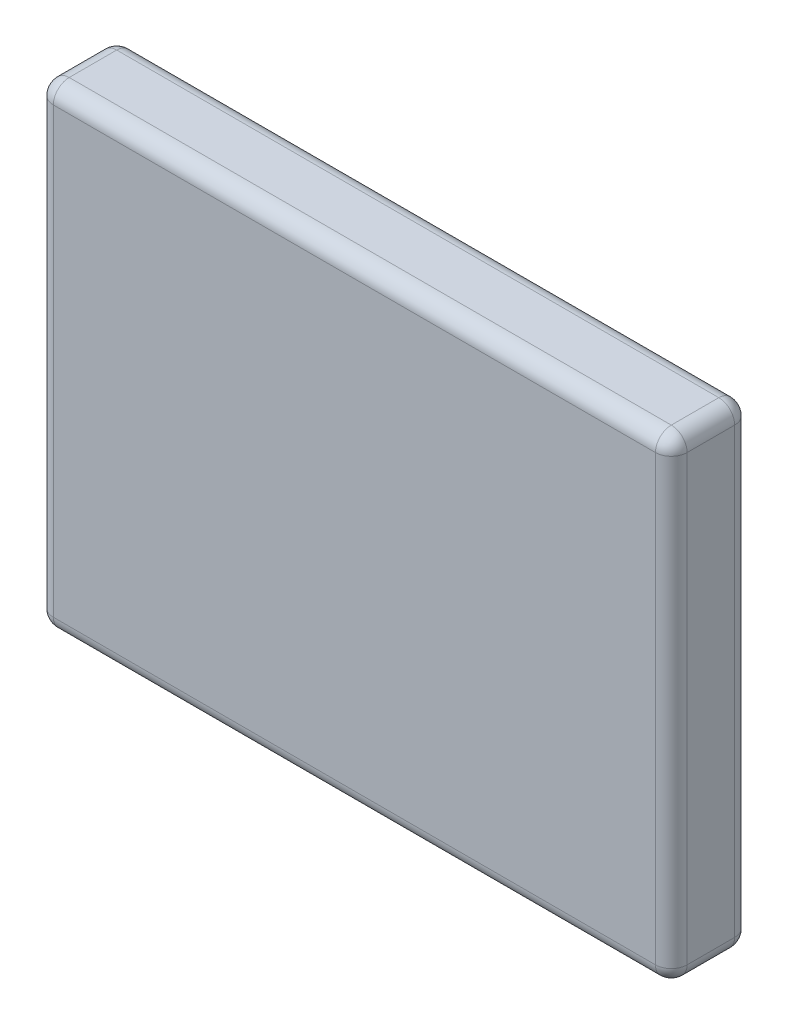
ISO-10303-21;
HEADER;
FILE_DESCRIPTION(('STEP AP214'),'2;1');
FILE_NAME('part.step','',(''),(''),'','','');
FILE_SCHEMA(('AUTOMOTIVE_DESIGN { 1 0 10303 214 1 1 1 1 }'));
ENDSEC;
DATA;
#1=APPLICATION_CONTEXT('core data for automotive mechanical design processes');
#2=APPLICATION_PROTOCOL_DEFINITION('international standard','automotive_design',2000,#1);
#3=PRODUCT_CONTEXT('',#1,'mechanical');
#4=PRODUCT('Part','Part','',(#3));
#5=PRODUCT_RELATED_PRODUCT_CATEGORY('part','',(#4));
#6=PRODUCT_DEFINITION_FORMATION('','',#4);
#7=PRODUCT_DEFINITION_CONTEXT('part definition',#1,'design');
#8=PRODUCT_DEFINITION('design','',#6,#7);
#9=PRODUCT_DEFINITION_SHAPE('','',#8);
#10=(LENGTH_UNIT() NAMED_UNIT(*) SI_UNIT(.MILLI.,.METRE.));
#11=(NAMED_UNIT(*) PLANE_ANGLE_UNIT() SI_UNIT($,.RADIAN.));
#12=(NAMED_UNIT(*) SI_UNIT($,.STERADIAN.) SOLID_ANGLE_UNIT());
#13=UNCERTAINTY_MEASURE_WITH_UNIT(LENGTH_MEASURE(1.E-05),#10,'distance_accuracy_value','');
#14=(GEOMETRIC_REPRESENTATION_CONTEXT(3) GLOBAL_UNCERTAINTY_ASSIGNED_CONTEXT((#13)) GLOBAL_UNIT_ASSIGNED_CONTEXT((#10,
#11,#12)) REPRESENTATION_CONTEXT('',''));
#15=CARTESIAN_POINT('',(0.,0.,0.));
#16=DIRECTION('',(0.,0.,1.));
#17=DIRECTION('',(1.,0.,0.));
#18=AXIS2_PLACEMENT_3D('',#15,#16,#17);
#19=CARTESIAN_POINT('',(0.,0.,12.7));
#20=DIRECTION('',(1.,0.,0.));
#21=DIRECTION('',(0.,0.,-1.));
#22=AXIS2_PLACEMENT_3D('',#19,#20,#21);
#23=PLANE('',#22);
#24=DIRECTION('',(0.,-1.,0.));
#25=VECTOR('',#24,1.);
#26=CARTESIAN_POINT('',(0.,0.,10.16));
#27=LINE('',#26,#25);
#28=CARTESIAN_POINT('',(0.,2.54,10.16));
#29=VERTEX_POINT('',#28);
#30=CARTESIAN_POINT('',(0.,73.66,10.16));
#31=VERTEX_POINT('',#30);
#32=EDGE_CURVE('E157',#29,#31,#27,.F.);
#33=ORIENTED_EDGE('',*,*,#32,.T.);
#34=DIRECTION('',(0.,0.,-1.));
#35=VECTOR('',#34,1.);
#36=CARTESIAN_POINT('',(0.,73.66,12.7));
#37=LINE('',#36,#35);
#38=CARTESIAN_POINT('',(0.,73.66,2.54));
#39=VERTEX_POINT('',#38);
#40=EDGE_CURVE('E165',#31,#39,#37,.T.);
#41=ORIENTED_EDGE('',*,*,#40,.T.);
#42=DIRECTION('',(0.,-1.,0.));
#43=VECTOR('',#42,1.);
#44=CARTESIAN_POINT('',(0.,0.,2.54));
#45=LINE('',#44,#43);
#46=CARTESIAN_POINT('',(0.,2.54,2.54));
#47=VERTEX_POINT('',#46);
#48=EDGE_CURVE('E137',#39,#47,#45,.T.);
#49=ORIENTED_EDGE('',*,*,#48,.T.);
#50=DIRECTION('',(0.,0.,-1.));
#51=VECTOR('',#50,1.);
#52=CARTESIAN_POINT('',(0.,2.54,12.7));
#53=LINE('',#52,#51);
#54=EDGE_CURVE('E152',#47,#29,#53,.F.);
#55=ORIENTED_EDGE('',*,*,#54,.T.);
#56=EDGE_LOOP('',(#33,#41,#49,#55));
#57=FACE_BOUND('',#56,.T.);
#58=ADVANCED_FACE('F39',(#57),#23,.F.);
#59=CARTESIAN_POINT('',(0.,0.,12.7));
#60=DIRECTION('',(0.,1.,0.));
#61=DIRECTION('',(0.,0.,1.));
#62=AXIS2_PLACEMENT_3D('',#59,#60,#61);
#63=PLANE('',#62);
#64=DIRECTION('',(1.,0.,0.));
#65=VECTOR('',#64,1.);
#66=CARTESIAN_POINT('',(101.6,0.,2.54));
#67=LINE('',#66,#65);
#68=CARTESIAN_POINT('',(2.54,0.,2.54));
#69=VERTEX_POINT('',#68);
#70=CARTESIAN_POINT('',(99.06,0.,2.54));
#71=VERTEX_POINT('',#70);
#72=EDGE_CURVE('E176',#69,#71,#67,.T.);
#73=ORIENTED_EDGE('',*,*,#72,.T.);
#74=DIRECTION('',(0.,0.,-1.));
#75=VECTOR('',#74,1.);
#76=CARTESIAN_POINT('',(99.06,0.,12.7));
#77=LINE('',#76,#75);
#78=CARTESIAN_POINT('',(99.06,0.,10.16));
#79=VERTEX_POINT('',#78);
#80=EDGE_CURVE('E185',#71,#79,#77,.F.);
#81=ORIENTED_EDGE('',*,*,#80,.T.);
#82=DIRECTION('',(1.,0.,0.));
#83=VECTOR('',#82,1.);
#84=CARTESIAN_POINT('',(0.,0.,10.16));
#85=LINE('',#84,#83);
#86=CARTESIAN_POINT('',(2.54,0.,10.16));
#87=VERTEX_POINT('',#86);
#88=EDGE_CURVE('E179',#79,#87,#85,.F.);
#89=ORIENTED_EDGE('',*,*,#88,.T.);
#90=DIRECTION('',(0.,0.,-1.));
#91=VECTOR('',#90,1.);
#92=CARTESIAN_POINT('',(2.54,0.,12.7));
#93=LINE('',#92,#91);
#94=EDGE_CURVE('E173',#87,#69,#93,.T.);
#95=ORIENTED_EDGE('',*,*,#94,.T.);
#96=EDGE_LOOP('',(#73,#81,#89,#95));
#97=FACE_BOUND('',#96,.T.);
#98=ADVANCED_FACE('F328',(#97),#63,.F.);
#99=CARTESIAN_POINT('',(101.6,0.,12.7));
#100=DIRECTION('',(-1.,0.,0.));
#101=DIRECTION('',(0.,0.,1.));
#102=AXIS2_PLACEMENT_3D('',#99,#100,#101);
#103=PLANE('',#102);
#104=DIRECTION('',(0.,1.,0.));
#105=VECTOR('',#104,1.);
#106=CARTESIAN_POINT('',(101.6,76.2,2.54));
#107=LINE('',#106,#105);
#108=CARTESIAN_POINT('',(101.6,2.54,2.54));
#109=VERTEX_POINT('',#108);
#110=CARTESIAN_POINT('',(101.6,73.66,2.54));
#111=VERTEX_POINT('',#110);
#112=EDGE_CURVE('E189',#109,#111,#107,.T.);
#113=ORIENTED_EDGE('',*,*,#112,.T.);
#114=DIRECTION('',(0.,0.,-1.));
#115=VECTOR('',#114,1.);
#116=CARTESIAN_POINT('',(101.6,73.66,12.7));
#117=LINE('',#116,#115);
#118=CARTESIAN_POINT('',(101.6,73.66,10.16));
#119=VERTEX_POINT('',#118);
#120=EDGE_CURVE('E192',#111,#119,#117,.F.);
#121=ORIENTED_EDGE('',*,*,#120,.T.);
#122=DIRECTION('',(0.,1.,0.));
#123=VECTOR('',#122,1.);
#124=CARTESIAN_POINT('',(101.6,0.,10.16));
#125=LINE('',#124,#123);
#126=CARTESIAN_POINT('',(101.6,2.54,10.16));
#127=VERTEX_POINT('',#126);
#128=EDGE_CURVE('E187',#119,#127,#125,.F.);
#129=ORIENTED_EDGE('',*,*,#128,.T.);
#130=DIRECTION('',(0.,0.,-1.));
#131=VECTOR('',#130,1.);
#132=CARTESIAN_POINT('',(101.6,2.54,12.7));
#133=LINE('',#132,#131);
#134=EDGE_CURVE('E184',#127,#109,#133,.T.);
#135=ORIENTED_EDGE('',*,*,#134,.T.);
#136=EDGE_LOOP('',(#113,#121,#129,#135));
#137=FACE_BOUND('',#136,.T.);
#138=ADVANCED_FACE('F296',(#137),#103,.F.);
#139=CARTESIAN_POINT('',(0.,76.2,12.7));
#140=DIRECTION('',(0.,-1.,0.));
#141=DIRECTION('',(0.,0.,-1.));
#142=AXIS2_PLACEMENT_3D('',#139,#140,#141);
#143=PLANE('',#142);
#144=DIRECTION('',(-1.,0.,0.));
#145=VECTOR('',#144,1.);
#146=CARTESIAN_POINT('',(0.,76.2,2.54));
#147=LINE('',#146,#145);
#148=CARTESIAN_POINT('',(99.06,76.2,2.54));
#149=VERTEX_POINT('',#148);
#150=CARTESIAN_POINT('',(2.54,76.2,2.54));
#151=VERTEX_POINT('',#150);
#152=EDGE_CURVE('E197',#149,#151,#147,.T.);
#153=ORIENTED_EDGE('',*,*,#152,.T.);
#154=DIRECTION('',(0.,0.,-1.));
#155=VECTOR('',#154,1.);
#156=CARTESIAN_POINT('',(2.54,76.2,12.7));
#157=LINE('',#156,#155);
#158=CARTESIAN_POINT('',(2.54,76.2,10.16));
#159=VERTEX_POINT('',#158);
#160=EDGE_CURVE('E199',#151,#159,#157,.F.);
#161=ORIENTED_EDGE('',*,*,#160,.T.);
#162=DIRECTION('',(-1.,0.,0.));
#163=VECTOR('',#162,1.);
#164=CARTESIAN_POINT('',(0.,76.2,10.16));
#165=LINE('',#164,#163);
#166=CARTESIAN_POINT('',(99.06,76.2,10.16));
#167=VERTEX_POINT('',#166);
#168=EDGE_CURVE('E193',#159,#167,#165,.F.);
#169=ORIENTED_EDGE('',*,*,#168,.T.);
#170=DIRECTION('',(0.,0.,-1.));
#171=VECTOR('',#170,1.);
#172=CARTESIAN_POINT('',(99.06,76.2,12.7));
#173=LINE('',#172,#171);
#174=EDGE_CURVE('E195',#167,#149,#173,.T.);
#175=ORIENTED_EDGE('',*,*,#174,.T.);
#176=EDGE_LOOP('',(#153,#161,#169,#175));
#177=FACE_BOUND('',#176,.T.);
#178=ADVANCED_FACE('F274',(#177),#143,.F.);
#179=CARTESIAN_POINT('',(0.,0.,12.7));
#180=DIRECTION('',(0.,0.,-1.));
#181=DIRECTION('',(-1.,0.,0.));
#182=AXIS2_PLACEMENT_3D('',#179,#180,#181);
#183=PLANE('',#182);
#184=DIRECTION('',(-1.,0.,0.));
#185=VECTOR('',#184,1.);
#186=CARTESIAN_POINT('',(0.,73.66,12.7));
#187=LINE('',#186,#185);
#188=CARTESIAN_POINT('',(99.06,73.66,12.7));
#189=VERTEX_POINT('',#188);
#190=CARTESIAN_POINT('',(2.54,73.66,12.7));
#191=VERTEX_POINT('',#190);
#192=EDGE_CURVE('E205',#189,#191,#187,.T.);
#193=ORIENTED_EDGE('',*,*,#192,.T.);
#194=DIRECTION('',(0.,-1.,0.));
#195=VECTOR('',#194,1.);
#196=CARTESIAN_POINT('',(2.54,0.,12.7));
#197=LINE('',#196,#195);
#198=CARTESIAN_POINT('',(2.54,2.54,12.7));
#199=VERTEX_POINT('',#198);
#200=EDGE_CURVE('E11',#191,#199,#197,.T.);
#201=ORIENTED_EDGE('',*,*,#200,.T.);
#202=DIRECTION('',(1.,0.,0.));
#203=VECTOR('',#202,1.);
#204=CARTESIAN_POINT('',(0.,2.54,12.7));
#205=LINE('',#204,#203);
#206=CARTESIAN_POINT('',(99.06,2.54,12.7));
#207=VERTEX_POINT('',#206);
#208=EDGE_CURVE('E48',#199,#207,#205,.T.);
#209=ORIENTED_EDGE('',*,*,#208,.T.);
#210=DIRECTION('',(0.,1.,0.));
#211=VECTOR('',#210,1.);
#212=CARTESIAN_POINT('',(99.06,0.,12.7));
#213=LINE('',#212,#211);
#214=EDGE_CURVE('E204',#207,#189,#213,.T.);
#215=ORIENTED_EDGE('',*,*,#214,.T.);
#216=EDGE_LOOP('',(#193,#201,#209,#215));
#217=FACE_BOUND('',#216,.T.);
#218=ADVANCED_FACE('F284',(#217),#183,.F.);
#219=CARTESIAN_POINT('',(0.,0.,0.));
#220=DIRECTION('',(0.,0.,-1.));
#221=DIRECTION('',(-1.,0.,0.));
#222=AXIS2_PLACEMENT_3D('',#219,#220,#221);
#223=PLANE('',#222);
#224=DIRECTION('',(1.,0.,0.));
#225=VECTOR('',#224,1.);
#226=CARTESIAN_POINT('',(0.,2.54,0.));
#227=LINE('',#226,#225);
#228=CARTESIAN_POINT('',(99.06,2.54,0.));
#229=VERTEX_POINT('',#228);
#230=CARTESIAN_POINT('',(2.54,2.54,0.));
#231=VERTEX_POINT('',#230);
#232=EDGE_CURVE('E175',#229,#231,#227,.F.);
#233=ORIENTED_EDGE('',*,*,#232,.T.);
#234=DIRECTION('',(0.,-1.,0.));
#235=VECTOR('',#234,1.);
#236=CARTESIAN_POINT('',(2.54,76.2,0.));
#237=LINE('',#236,#235);
#238=CARTESIAN_POINT('',(2.54,73.66,0.));
#239=VERTEX_POINT('',#238);
#240=EDGE_CURVE('E140',#231,#239,#237,.F.);
#241=ORIENTED_EDGE('',*,*,#240,.T.);
#242=DIRECTION('',(-1.,0.,0.));
#243=VECTOR('',#242,1.);
#244=CARTESIAN_POINT('',(101.6,73.66,0.));
#245=LINE('',#244,#243);
#246=CARTESIAN_POINT('',(99.06,73.66,0.));
#247=VERTEX_POINT('',#246);
#248=EDGE_CURVE('E164',#239,#247,#245,.F.);
#249=ORIENTED_EDGE('',*,*,#248,.T.);
#250=DIRECTION('',(0.,1.,0.));
#251=VECTOR('',#250,1.);
#252=CARTESIAN_POINT('',(99.06,0.,0.));
#253=LINE('',#252,#251);
#254=EDGE_CURVE('E168',#247,#229,#253,.F.);
#255=ORIENTED_EDGE('',*,*,#254,.T.);
#256=EDGE_LOOP('',(#233,#241,#249,#255));
#257=FACE_BOUND('',#256,.T.);
#258=ADVANCED_FACE('F362',(#257),#223,.T.);
#259=CARTESIAN_POINT('',(99.06,0.,10.16));
#260=DIRECTION('',(0.,1.,0.));
#261=DIRECTION('',(0.,0.,1.));
#262=AXIS2_PLACEMENT_3D('',#259,#260,#261);
#263=CYLINDRICAL_SURFACE('',#262,2.54);
#264=CARTESIAN_POINT('',(99.06,73.66,10.16));
#265=DIRECTION('',(0.,1.,0.));
#266=DIRECTION('',(0.,0.,1.));
#267=AXIS2_PLACEMENT_3D('',#264,#265,#266);
#268=CIRCLE('',#267,2.54);
#269=EDGE_CURVE('E43',#189,#119,#268,.T.);
#270=ORIENTED_EDGE('',*,*,#269,.F.);
#271=ORIENTED_EDGE('',*,*,#214,.F.);
#272=CARTESIAN_POINT('',(99.06,2.54,10.16));
#273=DIRECTION('',(0.,-1.,0.));
#274=DIRECTION('',(0.,0.,-1.));
#275=AXIS2_PLACEMENT_3D('',#272,#273,#274);
#276=CIRCLE('',#275,2.54);
#277=EDGE_CURVE('E251',#127,#207,#276,.T.);
#278=ORIENTED_EDGE('',*,*,#277,.F.);
#279=ORIENTED_EDGE('',*,*,#128,.F.);
#280=EDGE_LOOP('',(#270,#271,#278,#279));
#281=FACE_BOUND('',#280,.T.);
#282=ADVANCED_FACE('F41',(#281),#263,.T.);
#283=CARTESIAN_POINT('',(99.06,73.66,10.16));
#284=DIRECTION('',(1.,0.,0.));
#285=DIRECTION('',(0.,0.,-1.));
#286=AXIS2_PLACEMENT_3D('',#283,#284,#285);
#287=SPHERICAL_SURFACE('',#286,2.54);
#288=CARTESIAN_POINT('',(99.06,73.66,10.16));
#289=DIRECTION('',(1.,0.,0.));
#290=DIRECTION('',(0.,0.,-1.));
#291=AXIS2_PLACEMENT_3D('',#288,#289,#290);
#292=CIRCLE('',#291,2.54);
#293=EDGE_CURVE('E250',#189,#167,#292,.F.);
#294=ORIENTED_EDGE('',*,*,#293,.F.);
#295=ORIENTED_EDGE('',*,*,#269,.T.);
#296=CARTESIAN_POINT('',(99.06,73.66,10.16));
#297=DIRECTION('',(0.,0.,1.));
#298=DIRECTION('',(1.,0.,0.));
#299=AXIS2_PLACEMENT_3D('',#296,#297,#298);
#300=CIRCLE('',#299,2.54);
#301=EDGE_CURVE('E253',#167,#119,#300,.F.);
#302=ORIENTED_EDGE('',*,*,#301,.F.);
#303=EDGE_LOOP('',(#294,#295,#302));
#304=FACE_BOUND('',#303,.T.);
#305=ADVANCED_FACE('F262',(#304),#287,.T.);
#306=CARTESIAN_POINT('',(99.06,2.54,10.16));
#307=DIRECTION('',(0.,0.,1.));
#308=DIRECTION('',(1.,0.,0.));
#309=AXIS2_PLACEMENT_3D('',#306,#307,#308);
#310=SPHERICAL_SURFACE('',#309,2.54);
#311=CARTESIAN_POINT('',(99.06,2.54,10.16));
#312=DIRECTION('',(0.,0.,1.));
#313=DIRECTION('',(1.,0.,0.));
#314=AXIS2_PLACEMENT_3D('',#311,#312,#313);
#315=CIRCLE('',#314,2.54);
#316=EDGE_CURVE('E245',#127,#79,#315,.F.);
#317=ORIENTED_EDGE('',*,*,#316,.F.);
#318=ORIENTED_EDGE('',*,*,#277,.T.);
#319=CARTESIAN_POINT('',(99.06,2.54,10.16));
#320=DIRECTION('',(1.,0.,0.));
#321=DIRECTION('',(0.,0.,-1.));
#322=AXIS2_PLACEMENT_3D('',#319,#320,#321);
#323=CIRCLE('',#322,2.54);
#324=EDGE_CURVE('E243',#79,#207,#323,.F.);
#325=ORIENTED_EDGE('',*,*,#324,.F.);
#326=EDGE_LOOP('',(#317,#318,#325));
#327=FACE_BOUND('',#326,.T.);
#328=ADVANCED_FACE('F292',(#327),#310,.T.);
#329=CARTESIAN_POINT('',(99.06,73.66,12.7));
#330=DIRECTION('',(0.,0.,-1.));
#331=DIRECTION('',(-1.,0.,0.));
#332=AXIS2_PLACEMENT_3D('',#329,#330,#331);
#333=CYLINDRICAL_SURFACE('',#332,2.54);
#334=ORIENTED_EDGE('',*,*,#301,.T.);
#335=ORIENTED_EDGE('',*,*,#120,.F.);
#336=CARTESIAN_POINT('',(99.06,73.66,2.54));
#337=DIRECTION('',(0.,0.,-1.));
#338=DIRECTION('',(-1.,0.,0.));
#339=AXIS2_PLACEMENT_3D('',#336,#337,#338);
#340=CIRCLE('',#339,2.54);
#341=EDGE_CURVE('E240',#149,#111,#340,.T.);
#342=ORIENTED_EDGE('',*,*,#341,.F.);
#343=ORIENTED_EDGE('',*,*,#174,.F.);
#344=EDGE_LOOP('',(#334,#335,#342,#343));
#345=FACE_BOUND('',#344,.T.);
#346=ADVANCED_FACE('F271',(#345),#333,.T.);
#347=CARTESIAN_POINT('',(0.,73.66,10.16));
#348=DIRECTION('',(-1.,0.,0.));
#349=DIRECTION('',(0.,0.,1.));
#350=AXIS2_PLACEMENT_3D('',#347,#348,#349);
#351=CYLINDRICAL_SURFACE('',#350,2.54);
#352=ORIENTED_EDGE('',*,*,#293,.T.);
#353=ORIENTED_EDGE('',*,*,#168,.F.);
#354=CARTESIAN_POINT('',(2.54,73.66,10.16));
#355=DIRECTION('',(-1.,0.,0.));
#356=DIRECTION('',(0.,0.,1.));
#357=AXIS2_PLACEMENT_3D('',#354,#355,#356);
#358=CIRCLE('',#357,2.54);
#359=EDGE_CURVE('E231',#191,#159,#358,.T.);
#360=ORIENTED_EDGE('',*,*,#359,.F.);
#361=ORIENTED_EDGE('',*,*,#192,.F.);
#362=EDGE_LOOP('',(#352,#353,#360,#361));
#363=FACE_BOUND('',#362,.T.);
#364=ADVANCED_FACE('F282',(#363),#351,.T.);
#365=CARTESIAN_POINT('',(2.54,0.,10.16));
#366=DIRECTION('',(0.,-1.,0.));
#367=DIRECTION('',(0.,0.,-1.));
#368=AXIS2_PLACEMENT_3D('',#365,#366,#367);
#369=CYLINDRICAL_SURFACE('',#368,2.54);
#370=CARTESIAN_POINT('',(2.54,2.54,10.16));
#371=DIRECTION('',(0.,-1.,0.));
#372=DIRECTION('',(0.,0.,-1.));
#373=AXIS2_PLACEMENT_3D('',#370,#371,#372);
#374=CIRCLE('',#373,2.54);
#375=EDGE_CURVE('E226',#199,#29,#374,.T.);
#376=ORIENTED_EDGE('',*,*,#375,.F.);
#377=ORIENTED_EDGE('',*,*,#200,.F.);
#378=CARTESIAN_POINT('',(2.54,73.66,10.16));
#379=DIRECTION('',(0.,1.,0.));
#380=DIRECTION('',(0.,0.,1.));
#381=AXIS2_PLACEMENT_3D('',#378,#379,#380);
#382=CIRCLE('',#381,2.54);
#383=EDGE_CURVE('E232',#31,#191,#382,.T.);
#384=ORIENTED_EDGE('',*,*,#383,.F.);
#385=ORIENTED_EDGE('',*,*,#32,.F.);
#386=EDGE_LOOP('',(#376,#377,#384,#385));
#387=FACE_BOUND('',#386,.T.);
#388=ADVANCED_FACE('F287',(#387),#369,.T.);
#389=CARTESIAN_POINT('',(0.,2.54,10.16));
#390=DIRECTION('',(1.,0.,0.));
#391=DIRECTION('',(0.,0.,-1.));
#392=AXIS2_PLACEMENT_3D('',#389,#390,#391);
#393=CYLINDRICAL_SURFACE('',#392,2.54);
#394=ORIENTED_EDGE('',*,*,#324,.T.);
#395=ORIENTED_EDGE('',*,*,#208,.F.);
#396=CARTESIAN_POINT('',(2.54,2.54,10.16));
#397=DIRECTION('',(-1.,0.,0.));
#398=DIRECTION('',(0.,0.,1.));
#399=AXIS2_PLACEMENT_3D('',#396,#397,#398);
#400=CIRCLE('',#399,2.54);
#401=EDGE_CURVE('E57',#87,#199,#400,.T.);
#402=ORIENTED_EDGE('',*,*,#401,.F.);
#403=ORIENTED_EDGE('',*,*,#88,.F.);
#404=EDGE_LOOP('',(#394,#395,#402,#403));
#405=FACE_BOUND('',#404,.T.);
#406=ADVANCED_FACE('F286',(#405),#393,.T.);
#407=CARTESIAN_POINT('',(99.06,2.54,12.7));
#408=DIRECTION('',(0.,0.,-1.));
#409=DIRECTION('',(-1.,0.,0.));
#410=AXIS2_PLACEMENT_3D('',#407,#408,#409);
#411=CYLINDRICAL_SURFACE('',#410,2.54);
#412=ORIENTED_EDGE('',*,*,#316,.T.);
#413=ORIENTED_EDGE('',*,*,#80,.F.);
#414=CARTESIAN_POINT('',(99.06,2.54,2.54));
#415=DIRECTION('',(0.,0.,-1.));
#416=DIRECTION('',(-1.,0.,0.));
#417=AXIS2_PLACEMENT_3D('',#414,#415,#416);
#418=CIRCLE('',#417,2.54);
#419=EDGE_CURVE('E223',#109,#71,#418,.T.);
#420=ORIENTED_EDGE('',*,*,#419,.F.);
#421=ORIENTED_EDGE('',*,*,#134,.F.);
#422=EDGE_LOOP('',(#412,#413,#420,#421));
#423=FACE_BOUND('',#422,.T.);
#424=ADVANCED_FACE('F297',(#423),#411,.T.);
#425=CARTESIAN_POINT('',(99.06,0.,2.54));
#426=DIRECTION('',(0.,-1.,0.));
#427=DIRECTION('',(0.,0.,-1.));
#428=AXIS2_PLACEMENT_3D('',#425,#426,#427);
#429=CYLINDRICAL_SURFACE('',#428,2.54);
#430=CARTESIAN_POINT('',(99.06,73.66,2.54));
#431=DIRECTION('',(0.,1.,0.));
#432=DIRECTION('',(0.,0.,1.));
#433=AXIS2_PLACEMENT_3D('',#430,#431,#432);
#434=CIRCLE('',#433,2.54);
#435=EDGE_CURVE('E239',#111,#247,#434,.T.);
#436=ORIENTED_EDGE('',*,*,#435,.F.);
#437=ORIENTED_EDGE('',*,*,#112,.F.);
#438=CARTESIAN_POINT('',(99.06,2.54,2.54));
#439=DIRECTION('',(0.,-1.,0.));
#440=DIRECTION('',(0.,0.,-1.));
#441=AXIS2_PLACEMENT_3D('',#438,#439,#440);
#442=CIRCLE('',#441,2.54);
#443=EDGE_CURVE('E225',#229,#109,#442,.T.);
#444=ORIENTED_EDGE('',*,*,#443,.F.);
#445=ORIENTED_EDGE('',*,*,#254,.F.);
#446=EDGE_LOOP('',(#436,#437,#444,#445));
#447=FACE_BOUND('',#446,.T.);
#448=ADVANCED_FACE('F305',(#447),#429,.T.);
#449=CARTESIAN_POINT('',(99.06,73.66,2.54));
#450=DIRECTION('',(1.,0.,0.));
#451=DIRECTION('',(0.,0.,-1.));
#452=AXIS2_PLACEMENT_3D('',#449,#450,#451);
#453=SPHERICAL_SURFACE('',#452,2.54);
#454=ORIENTED_EDGE('',*,*,#341,.T.);
#455=ORIENTED_EDGE('',*,*,#435,.T.);
#456=CARTESIAN_POINT('',(99.06,73.66,2.54));
#457=DIRECTION('',(1.,0.,0.));
#458=DIRECTION('',(0.,0.,-1.));
#459=AXIS2_PLACEMENT_3D('',#456,#457,#458);
#460=CIRCLE('',#459,2.54);
#461=EDGE_CURVE('E218',#149,#247,#460,.F.);
#462=ORIENTED_EDGE('',*,*,#461,.F.);
#463=EDGE_LOOP('',(#454,#455,#462));
#464=FACE_BOUND('',#463,.T.);
#465=ADVANCED_FACE('F307',(#464),#453,.T.);
#466=CARTESIAN_POINT('',(2.54,73.66,10.16));
#467=DIRECTION('',(0.,0.,1.));
#468=DIRECTION('',(1.,0.,0.));
#469=AXIS2_PLACEMENT_3D('',#466,#467,#468);
#470=SPHERICAL_SURFACE('',#469,2.54);
#471=ORIENTED_EDGE('',*,*,#383,.T.);
#472=ORIENTED_EDGE('',*,*,#359,.T.);
#473=CARTESIAN_POINT('',(2.54,73.66,10.16));
#474=DIRECTION('',(0.,0.,1.));
#475=DIRECTION('',(1.,0.,0.));
#476=AXIS2_PLACEMENT_3D('',#473,#474,#475);
#477=CIRCLE('',#476,2.54);
#478=EDGE_CURVE('E216',#31,#159,#477,.F.);
#479=ORIENTED_EDGE('',*,*,#478,.F.);
#480=EDGE_LOOP('',(#471,#472,#479));
#481=FACE_BOUND('',#480,.T.);
#482=ADVANCED_FACE('F320',(#481),#470,.T.);
#483=CARTESIAN_POINT('',(2.54,2.54,10.16));
#484=DIRECTION('',(0.,0.,1.));
#485=DIRECTION('',(1.,0.,0.));
#486=AXIS2_PLACEMENT_3D('',#483,#484,#485);
#487=SPHERICAL_SURFACE('',#486,2.54);
#488=ORIENTED_EDGE('',*,*,#401,.T.);
#489=ORIENTED_EDGE('',*,*,#375,.T.);
#490=CARTESIAN_POINT('',(2.54,2.54,10.16));
#491=DIRECTION('',(0.,0.,1.));
#492=DIRECTION('',(1.,0.,0.));
#493=AXIS2_PLACEMENT_3D('',#490,#491,#492);
#494=CIRCLE('',#493,2.54);
#495=EDGE_CURVE('E156',#87,#29,#494,.F.);
#496=ORIENTED_EDGE('',*,*,#495,.F.);
#497=EDGE_LOOP('',(#488,#489,#496));
#498=FACE_BOUND('',#497,.T.);
#499=ADVANCED_FACE('F317',(#498),#487,.T.);
#500=CARTESIAN_POINT('',(99.06,2.54,2.54));
#501=DIRECTION('',(1.,0.,0.));
#502=DIRECTION('',(0.,0.,-1.));
#503=AXIS2_PLACEMENT_3D('',#500,#501,#502);
#504=SPHERICAL_SURFACE('',#503,2.54);
#505=ORIENTED_EDGE('',*,*,#443,.T.);
#506=ORIENTED_EDGE('',*,*,#419,.T.);
#507=CARTESIAN_POINT('',(99.06,2.54,2.54));
#508=DIRECTION('',(1.,0.,0.));
#509=DIRECTION('',(0.,0.,-1.));
#510=AXIS2_PLACEMENT_3D('',#507,#508,#509);
#511=CIRCLE('',#510,2.54);
#512=EDGE_CURVE('E213',#229,#71,#511,.F.);
#513=ORIENTED_EDGE('',*,*,#512,.F.);
#514=EDGE_LOOP('',(#505,#506,#513));
#515=FACE_BOUND('',#514,.T.);
#516=ADVANCED_FACE('F324',(#515),#504,.T.);
#517=CARTESIAN_POINT('',(0.,73.66,2.54));
#518=DIRECTION('',(1.,0.,0.));
#519=DIRECTION('',(0.,0.,-1.));
#520=AXIS2_PLACEMENT_3D('',#517,#518,#519);
#521=CYLINDRICAL_SURFACE('',#520,2.54);
#522=ORIENTED_EDGE('',*,*,#461,.T.);
#523=ORIENTED_EDGE('',*,*,#248,.F.);
#524=CARTESIAN_POINT('',(2.54,73.66,2.54));
#525=DIRECTION('',(-1.,0.,0.));
#526=DIRECTION('',(0.,0.,1.));
#527=AXIS2_PLACEMENT_3D('',#524,#525,#526);
#528=CIRCLE('',#527,2.54);
#529=EDGE_CURVE('E209',#151,#239,#528,.T.);
#530=ORIENTED_EDGE('',*,*,#529,.F.);
#531=ORIENTED_EDGE('',*,*,#152,.F.);
#532=EDGE_LOOP('',(#522,#523,#530,#531));
#533=FACE_BOUND('',#532,.T.);
#534=ADVANCED_FACE('F309',(#533),#521,.T.);
#535=CARTESIAN_POINT('',(2.54,73.66,12.7));
#536=DIRECTION('',(0.,0.,-1.));
#537=DIRECTION('',(-1.,0.,0.));
#538=AXIS2_PLACEMENT_3D('',#535,#536,#537);
#539=CYLINDRICAL_SURFACE('',#538,2.54);
#540=ORIENTED_EDGE('',*,*,#478,.T.);
#541=ORIENTED_EDGE('',*,*,#160,.F.);
#542=CARTESIAN_POINT('',(2.54,73.66,2.54));
#543=DIRECTION('',(0.,0.,-1.));
#544=DIRECTION('',(-1.,0.,0.));
#545=AXIS2_PLACEMENT_3D('',#542,#543,#544);
#546=CIRCLE('',#545,2.54);
#547=EDGE_CURVE('E151',#39,#151,#546,.T.);
#548=ORIENTED_EDGE('',*,*,#547,.F.);
#549=ORIENTED_EDGE('',*,*,#40,.F.);
#550=EDGE_LOOP('',(#540,#541,#548,#549));
#551=FACE_BOUND('',#550,.T.);
#552=ADVANCED_FACE('F312',(#551),#539,.T.);
#553=CARTESIAN_POINT('',(2.54,2.54,12.7));
#554=DIRECTION('',(0.,0.,-1.));
#555=DIRECTION('',(-1.,0.,0.));
#556=AXIS2_PLACEMENT_3D('',#553,#554,#555);
#557=CYLINDRICAL_SURFACE('',#556,2.54);
#558=ORIENTED_EDGE('',*,*,#495,.T.);
#559=ORIENTED_EDGE('',*,*,#54,.F.);
#560=CARTESIAN_POINT('',(2.54,2.54,2.54));
#561=DIRECTION('',(0.,0.,-1.));
#562=DIRECTION('',(-1.,0.,0.));
#563=AXIS2_PLACEMENT_3D('',#560,#561,#562);
#564=CIRCLE('',#563,2.54);
#565=EDGE_CURVE('E145',#69,#47,#564,.T.);
#566=ORIENTED_EDGE('',*,*,#565,.F.);
#567=ORIENTED_EDGE('',*,*,#94,.F.);
#568=EDGE_LOOP('',(#558,#559,#566,#567));
#569=FACE_BOUND('',#568,.T.);
#570=ADVANCED_FACE('F154',(#569),#557,.T.);
#571=CARTESIAN_POINT('',(0.,2.54,2.54));
#572=DIRECTION('',(-1.,0.,0.));
#573=DIRECTION('',(0.,0.,1.));
#574=AXIS2_PLACEMENT_3D('',#571,#572,#573);
#575=CYLINDRICAL_SURFACE('',#574,2.54);
#576=ORIENTED_EDGE('',*,*,#512,.T.);
#577=ORIENTED_EDGE('',*,*,#72,.F.);
#578=CARTESIAN_POINT('',(2.54,2.54,2.54));
#579=DIRECTION('',(-1.,0.,0.));
#580=DIRECTION('',(0.,0.,1.));
#581=AXIS2_PLACEMENT_3D('',#578,#579,#580);
#582=CIRCLE('',#581,2.54);
#583=EDGE_CURVE('E146',#231,#69,#582,.T.);
#584=ORIENTED_EDGE('',*,*,#583,.F.);
#585=ORIENTED_EDGE('',*,*,#232,.F.);
#586=EDGE_LOOP('',(#576,#577,#584,#585));
#587=FACE_BOUND('',#586,.T.);
#588=ADVANCED_FACE('F343',(#587),#575,.T.);
#589=CARTESIAN_POINT('',(2.54,73.66,2.54));
#590=DIRECTION('',(0.,1.,0.));
#591=DIRECTION('',(0.,0.,1.));
#592=AXIS2_PLACEMENT_3D('',#589,#590,#591);
#593=SPHERICAL_SURFACE('',#592,2.54);
#594=ORIENTED_EDGE('',*,*,#547,.T.);
#595=ORIENTED_EDGE('',*,*,#529,.T.);
#596=CARTESIAN_POINT('',(2.54,73.66,2.54));
#597=DIRECTION('',(0.,1.,0.));
#598=DIRECTION('',(0.,0.,1.));
#599=AXIS2_PLACEMENT_3D('',#596,#597,#598);
#600=CIRCLE('',#599,2.54);
#601=EDGE_CURVE('E143',#39,#239,#600,.F.);
#602=ORIENTED_EDGE('',*,*,#601,.F.);
#603=EDGE_LOOP('',(#594,#595,#602));
#604=FACE_BOUND('',#603,.T.);
#605=ADVANCED_FACE('F344',(#604),#593,.T.);
#606=CARTESIAN_POINT('',(2.54,2.54,2.54));
#607=DIRECTION('',(0.,-1.,0.));
#608=DIRECTION('',(0.,0.,-1.));
#609=AXIS2_PLACEMENT_3D('',#606,#607,#608);
#610=SPHERICAL_SURFACE('',#609,2.54);
#611=ORIENTED_EDGE('',*,*,#583,.T.);
#612=ORIENTED_EDGE('',*,*,#565,.T.);
#613=CARTESIAN_POINT('',(2.54,2.54,2.54));
#614=DIRECTION('',(0.,-1.,0.));
#615=DIRECTION('',(0.,0.,-1.));
#616=AXIS2_PLACEMENT_3D('',#613,#614,#615);
#617=CIRCLE('',#616,2.54);
#618=EDGE_CURVE('E135',#231,#47,#617,.F.);
#619=ORIENTED_EDGE('',*,*,#618,.F.);
#620=EDGE_LOOP('',(#611,#612,#619));
#621=FACE_BOUND('',#620,.T.);
#622=ADVANCED_FACE('F148',(#621),#610,.T.);
#623=CARTESIAN_POINT('',(2.54,0.,2.54));
#624=DIRECTION('',(0.,1.,0.));
#625=DIRECTION('',(0.,0.,1.));
#626=AXIS2_PLACEMENT_3D('',#623,#624,#625);
#627=CYLINDRICAL_SURFACE('',#626,2.54);
#628=ORIENTED_EDGE('',*,*,#601,.T.);
#629=ORIENTED_EDGE('',*,*,#240,.F.);
#630=ORIENTED_EDGE('',*,*,#618,.T.);
#631=ORIENTED_EDGE('',*,*,#48,.F.);
#632=EDGE_LOOP('',(#628,#629,#630,#631));
#633=FACE_BOUND('',#632,.T.);
#634=ADVANCED_FACE('F131',(#633),#627,.T.);
#635=CLOSED_SHELL('',(#58,#98,#138,#178,#218,#258,#282,#305,#328,#346,#364,#388,#406,#424,#448,
#465,#482,#499,#516,#534,#552,#570,#588,#605,#622,#634));
#636=MANIFOLD_SOLID_BREP('B2',#635);
#637=ADVANCED_BREP_SHAPE_REPRESENTATION('',(#18,#636),#14);
#638=SHAPE_DEFINITION_REPRESENTATION(#9,#637);
ENDSEC;
END-ISO-10303-21;
